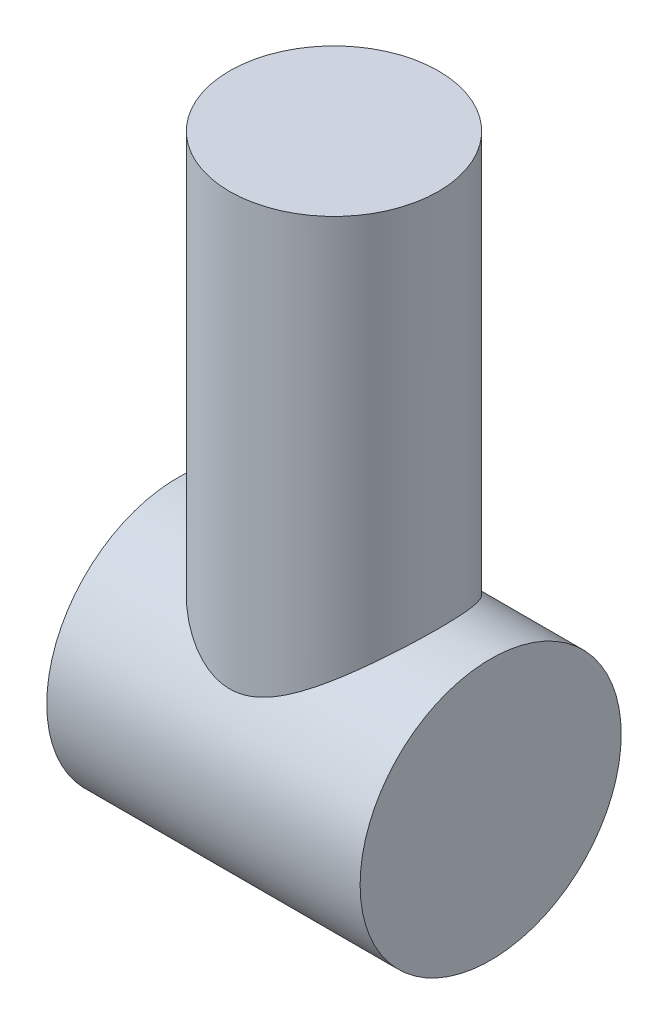
ISO-10303-21;
HEADER;
FILE_DESCRIPTION(('STEP AP214'),'2;1');
FILE_NAME('part.step','',(''),(''),'','','');
FILE_SCHEMA(('AUTOMOTIVE_DESIGN { 1 0 10303 214 1 1 1 1 }'));
ENDSEC;
DATA;
#1=APPLICATION_CONTEXT('core data for automotive mechanical design processes');
#2=APPLICATION_PROTOCOL_DEFINITION('international standard','automotive_design',2000,#1);
#3=PRODUCT_CONTEXT('',#1,'mechanical');
#4=PRODUCT('Part','Part','',(#3));
#5=PRODUCT_RELATED_PRODUCT_CATEGORY('part','',(#4));
#6=PRODUCT_DEFINITION_FORMATION('','',#4);
#7=PRODUCT_DEFINITION_CONTEXT('part definition',#1,'design');
#8=PRODUCT_DEFINITION('design','',#6,#7);
#9=PRODUCT_DEFINITION_SHAPE('','',#8);
#10=(LENGTH_UNIT() NAMED_UNIT(*) SI_UNIT(.MILLI.,.METRE.));
#11=(NAMED_UNIT(*) PLANE_ANGLE_UNIT() SI_UNIT($,.RADIAN.));
#12=(NAMED_UNIT(*) SI_UNIT($,.STERADIAN.) SOLID_ANGLE_UNIT());
#13=UNCERTAINTY_MEASURE_WITH_UNIT(LENGTH_MEASURE(1.E-05),#10,'distance_accuracy_value','');
#14=(GEOMETRIC_REPRESENTATION_CONTEXT(3) GLOBAL_UNCERTAINTY_ASSIGNED_CONTEXT((#13)) GLOBAL_UNIT_ASSIGNED_CONTEXT((#10,
#11,#12)) REPRESENTATION_CONTEXT('',''));
#15=CARTESIAN_POINT('',(0.,0.,0.));
#16=DIRECTION('',(0.,0.,1.));
#17=DIRECTION('',(1.,0.,0.));
#18=AXIS2_PLACEMENT_3D('',#15,#16,#17);
#19=CARTESIAN_POINT('',(60.,0.,0.));
#20=DIRECTION('',(-1.,0.,0.));
#21=DIRECTION('',(0.,0.,1.));
#22=AXIS2_PLACEMENT_3D('',#19,#20,#21);
#23=CYLINDRICAL_SURFACE('',#22,50.);
#24=CARTESIAN_POINT('',(60.,0.,0.));
#25=DIRECTION('',(1.,0.,0.));
#26=DIRECTION('',(0.,0.,-1.));
#27=AXIS2_PLACEMENT_3D('',#24,#25,#26);
#28=CIRCLE('',#27,50.);
#29=CARTESIAN_POINT('',(60.,0.,-50.));
#30=VERTEX_POINT('',#29);
#31=EDGE_CURVE('E49',#30,#30,#28,.T.);
#32=ORIENTED_EDGE('',*,*,#31,.F.);
#33=EDGE_LOOP('',(#32));
#34=FACE_BOUND('',#33,.T.);
#35=CARTESIAN_POINT('',(-60.,0.,0.));
#36=DIRECTION('',(1.,0.,0.));
#37=DIRECTION('',(0.,0.,-1.));
#38=AXIS2_PLACEMENT_3D('',#35,#36,#37);
#39=CIRCLE('',#38,50.);
#40=CARTESIAN_POINT('',(-60.,0.,-50.));
#41=VERTEX_POINT('',#40);
#42=EDGE_CURVE('E54',#41,#41,#39,.T.);
#43=ORIENTED_EDGE('',*,*,#42,.T.);
#44=EDGE_LOOP('',(#43));
#45=FACE_BOUND('',#44,.T.);
#46=CARTESIAN_POINT('',(0.,30.,-40.));
#47=CARTESIAN_POINT('',(-0.751122990398141,30.0000178203235,-39.9999925269122));
#48=CARTESIAN_POINT('',(-1.50252067673578,30.0283505775227,-39.9787855969021));
#49=CARTESIAN_POINT('',(-2.99911379598747,30.140285036925,-39.8944595355263));
#50=CARTESIAN_POINT('',(-3.74430464849889,30.2239244268036,-39.8313118242663));
#51=CARTESIAN_POINT('',(-5.22461390950294,30.4427179314504,-39.664339027872));
#52=CARTESIAN_POINT('',(-5.95969710727951,30.5780197900784,-39.5603972562764));
#53=CARTESIAN_POINT('',(-7.41320048597728,30.8942047512392,-39.3139687313561));
#54=CARTESIAN_POINT('',(-8.13162091077393,31.0750871861969,-39.1714825425525));
#55=CARTESIAN_POINT('',(-9.79623855598217,31.5456120543016,-38.7942530911844));
#56=CARTESIAN_POINT('',(-10.7345745089901,31.8511895478381,-38.5446631890411));
#57=CARTESIAN_POINT('',(-12.5730102406591,32.5168421586471,-37.9847853521626));
#58=CARTESIAN_POINT('',(-13.4730924401397,32.8769419916853,-37.6744698708897));
#59=CARTESIAN_POINT('',(-15.2361127138096,33.6378567935277,-36.9966861664557));
#60=CARTESIAN_POINT('',(-16.0989622360154,34.0387619478291,-36.62909035089));
#61=CARTESIAN_POINT('',(-17.7858296037221,34.8682704813726,-35.8403575703398));
#62=CARTESIAN_POINT('',(-18.6098484340316,35.2968731575066,-35.4192219642131));
#63=CARTESIAN_POINT('',(-19.962800083598,36.031959316776,-34.6681322839552));
#64=CARTESIAN_POINT('',(-20.5020008847586,36.3337762564148,-34.3519553126949));
#65=CARTESIAN_POINT('',(-21.5628606204046,36.9427723349765,-33.696170499488));
#66=CARTESIAN_POINT('',(-22.0845184096139,37.2499518220062,-33.3565611321833));
#67=CARTESIAN_POINT('',(-23.623511133256,38.1758681855748,-32.3028887759119));
#68=CARTESIAN_POINT('',(-24.6147593934666,38.7989243373928,-31.5540405410991));
#69=CARTESIAN_POINT('',(-26.5249290511882,40.0380449861333,-29.9661371804381));
#70=CARTESIAN_POINT('',(-27.4439078978661,40.6541146964379,-29.1271549863322));
#71=CARTESIAN_POINT('',(-29.2065896466564,41.8642400610944,-27.3593135576988));
#72=CARTESIAN_POINT('',(-30.0503175776481,42.458302996299,-26.4304844226525));
#73=CARTESIAN_POINT('',(-31.4977478575285,43.4960561011453,-24.6762448481654));
#74=CARTESIAN_POINT('',(-32.115949709036,43.946277346342,-23.8666249073291));
#75=CARTESIAN_POINT('',(-33.2956657657205,44.8156482694602,-22.1911709692297));
#76=CARTESIAN_POINT('',(-33.8571825249898,45.2347993471015,-21.3253395076118));
#77=CARTESIAN_POINT('',(-34.9176540877612,46.0339146282601,-19.5405613232695));
#78=CARTESIAN_POINT('',(-35.4166869738989,46.4139276328604,-18.6216830324404));
#79=CARTESIAN_POINT('',(-36.3471035811712,47.1277295837673,-16.7330672193071));
#80=CARTESIAN_POINT('',(-36.7784985245793,47.4615261970745,-15.7633381697048));
#81=CARTESIAN_POINT('',(-37.5036081471341,48.0258013846222,-13.9384865095607));
#82=CARTESIAN_POINT('',(-37.8083061181932,48.2642588167213,-13.0901842420799));
#83=CARTESIAN_POINT('',(-38.3621363453427,48.6993235485005,-11.3651565849685));
#84=CARTESIAN_POINT('',(-38.611274283141,48.8959351273485,-10.4884341121712));
#85=CARTESIAN_POINT('',(-39.0505076950679,49.2435186108503,-8.71176432790538));
#86=CARTESIAN_POINT('',(-39.2406256488954,49.3945078916683,-7.81182600076425));
#87=CARTESIAN_POINT('',(-39.5590682899697,49.6478656908502,-5.99426812973508));
#88=CARTESIAN_POINT('',(-39.6873922393692,49.7502336286538,-5.07664837485911));
#89=CARTESIAN_POINT('',(-39.8804773507374,49.90439933437,-3.22721452396158));
#90=CARTESIAN_POINT('',(-39.945013773773,49.9560182979649,-2.29536190464623));
#91=CARTESIAN_POINT('',(-40.0086189555882,50.0068917568229,-0.427984084828431));
#92=CARTESIAN_POINT('',(-40.0076875884325,50.0061461513564,0.507541122735245));
#93=CARTESIAN_POINT('',(-39.940373543346,49.9523076120166,2.37473598409272));
#94=CARTESIAN_POINT('',(-39.8739886492367,49.8992129056651,3.30640550626498));
#95=CARTESIAN_POINT('',(-39.6769088344371,49.7418694372033,5.1585049801366));
#96=CARTESIAN_POINT('',(-39.5462153970233,49.6376218549343,6.07893519056889));
#97=CARTESIAN_POINT('',(-39.231530031509,49.3872898676081,7.85194272429601));
#98=CARTESIAN_POINT('',(-39.0508410036233,49.2438030400832,8.70547932442694));
#99=CARTESIAN_POINT('',(-38.6364032712668,48.9158012940137,10.3914334358338));
#100=CARTESIAN_POINT('',(-38.402656949325,48.7312882177536,11.223851893551));
#101=CARTESIAN_POINT('',(-37.8849589444315,48.3243676644268,12.8634821504492));
#102=CARTESIAN_POINT('',(-37.6010007177952,48.1019552484034,13.6706906480812));
#103=CARTESIAN_POINT('',(-36.9860071963118,47.6227633439233,15.2564289879566));
#104=CARTESIAN_POINT('',(-36.654969108341,47.3659818164912,16.0349571252174));
#105=CARTESIAN_POINT('',(-35.9149758848323,46.7955625623542,17.6341627104269));
#106=CARTESIAN_POINT('',(-35.5015878586591,46.4788311973496,18.4516836914474));
#107=CARTESIAN_POINT('',(-34.6260290683881,45.813544738396,20.0465934668215));
#108=CARTESIAN_POINT('',(-34.1638557125227,45.4649879538238,20.8239801257304));
#109=CARTESIAN_POINT('',(-33.1942133591662,44.7409401722455,22.3372354631001));
#110=CARTESIAN_POINT('',(-32.6867269058143,44.3654388064734,23.0730879617356));
#111=CARTESIAN_POINT('',(-31.6298295701958,43.5926161796057,24.5019113874992));
#112=CARTESIAN_POINT('',(-31.0804166673752,43.195293867156,25.1948802450253));
#113=CARTESIAN_POINT('',(-29.8250349619769,42.3001280031166,26.675717367891));
#114=CARTESIAN_POINT('',(-29.11013718542,41.7984438686029,27.4537099186477));
#115=CARTESIAN_POINT('',(-27.6268595956598,40.7793182934675,28.9458751540258));
#116=CARTESIAN_POINT('',(-26.8584709774552,40.2618742665697,29.6600372872748));
#117=CARTESIAN_POINT('',(-25.2697606938863,39.219900601655,31.0247834218242));
#118=CARTESIAN_POINT('',(-24.4493795685694,38.6953634110918,31.6752923842437));
#119=CARTESIAN_POINT('',(-22.7587591147082,37.6499596814756,32.911019184688));
#120=CARTESIAN_POINT('',(-21.8885257757745,37.129092709865,33.4962448415303));
#121=CARTESIAN_POINT('',(-20.1844765819773,36.1520952340375,34.5469234519174));
#122=CARTESIAN_POINT('',(-19.3552298064082,35.6945625429145,35.018483626754));
#123=CARTESIAN_POINT('',(-17.6552891123811,34.8020934828063,35.9055707512528));
#124=CARTESIAN_POINT('',(-16.7845904681895,34.3671597020952,36.3210912913011));
#125=CARTESIAN_POINT('',(-15.0026590094379,33.5329818876261,37.0926047952671));
#126=CARTESIAN_POINT('',(-14.0914983189026,33.1336778882579,37.4486986895865));
#127=CARTESIAN_POINT('',(-12.227303572312,32.3848640082721,38.0981124136019));
#128=CARTESIAN_POINT('',(-11.2742889085727,32.0353313788736,38.3914609530259));
#129=CARTESIAN_POINT('',(-9.62274449861405,31.4989766076415,38.8316365511875));
#130=CARTESIAN_POINT('',(-8.93444736713032,31.2949200995624,38.9959424117446));
#131=CARTESIAN_POINT('',(-7.5400712811517,30.925733743202,39.289370612952));
#132=CARTESIAN_POINT('',(-6.83399476518628,30.7605985885085,39.418497750131));
#133=CARTESIAN_POINT('',(-5.40831772150548,30.4756179187466,39.6392392994006));
#134=CARTESIAN_POINT('',(-4.68874575134313,30.3556860877638,39.7309252338478));
#135=CARTESIAN_POINT('',(-3.23908053632723,30.1658012528448,39.8752904177208));
#136=CARTESIAN_POINT('',(-2.50898752314859,30.0958471501022,39.9279705247268));
#137=CARTESIAN_POINT('',(-1.0394838608478,30.0089915300664,39.9932930312782));
#138=CARTESIAN_POINT('',(-0.300043654572292,29.9924052776987,40.0056975107182));
#139=CARTESIAN_POINT('',(1.17755652750127,30.0140112862331,39.9894896642405));
#140=CARTESIAN_POINT('',(1.9157165235631,30.0522026720179,39.9608779935891));
#141=CARTESIAN_POINT('',(3.38552006284369,30.1815346199805,39.8632843359137));
#142=CARTESIAN_POINT('',(4.11715472679539,30.2727386443193,39.7942539623745));
#143=CARTESIAN_POINT('',(5.56787543572386,30.5039000358003,39.6173332957434));
#144=CARTESIAN_POINT('',(6.28695953307224,30.6438649003628,39.5094370265819));
#145=CARTESIAN_POINT('',(7.88949858997947,31.0079074788052,39.2246830386668));
#146=CARTESIAN_POINT('',(8.76827359809957,31.2443223192317,39.0372674964946));
#147=CARTESIAN_POINT('',(10.4955502095021,31.7723017335529,38.6087568241132));
#148=CARTESIAN_POINT('',(11.3440422707208,32.0638835111693,38.3676449446219));
#149=CARTESIAN_POINT('',(13.0107883990043,32.6907130254673,37.8349943016357));
#150=CARTESIAN_POINT('',(13.8289631444909,33.0260661720772,37.5433332313735));
#151=CARTESIAN_POINT('',(15.4326319181296,33.7290156244949,36.9130906312775));
#152=CARTESIAN_POINT('',(16.2181244733366,34.096613381211,36.5745069896743));
#153=CARTESIAN_POINT('',(17.5482226986558,34.7520109594331,35.950570582982));
#154=CARTESIAN_POINT('',(18.1004323193602,35.0344463590249,35.6756504438163));
#155=CARTESIAN_POINT('',(19.1879315027797,35.6084731483554,35.1027214184537));
#156=CARTESIAN_POINT('',(19.7232195681956,35.9000653438055,34.8047104970823));
#157=CARTESIAN_POINT('',(20.7771574243706,36.4897166458539,34.1860096289316));
#158=CARTESIAN_POINT('',(21.2958013415365,36.7877779744906,33.8653118013086));
#159=CARTESIAN_POINT('',(22.3162818835027,37.3877827124319,33.2017158410115));
#160=CARTESIAN_POINT('',(22.8181189345029,37.6897260230255,32.8588182719412));
#161=CARTESIAN_POINT('',(24.2994210919163,38.5986001848617,31.7964835010605));
#162=CARTESIAN_POINT('',(25.2538515818867,39.2081061075746,31.0438897247251));
#163=CARTESIAN_POINT('',(27.0935123486317,40.4175587893502,29.4520067449392));
#164=CARTESIAN_POINT('',(27.9787534237229,41.0175070283871,28.6127311174851));
#165=CARTESIAN_POINT('',(29.6884884002108,42.2021463483808,26.8353484515049));
#166=CARTESIAN_POINT('',(30.5119290032764,42.7864952156538,25.8959966280986));
#167=CARTESIAN_POINT('',(32.0774711862631,43.9166363093902,23.9293682337955));
#168=CARTESIAN_POINT('',(32.8195600365923,44.4624224969856,22.9020779473046));
#169=CARTESIAN_POINT('',(33.8636648695378,45.240406928385,21.2992395140421));
#170=CARTESIAN_POINT('',(34.1998321097064,45.4926735761747,20.7553340090037));
#171=CARTESIAN_POINT('',(34.8483808680768,45.9822175985869,19.6469466764766));
#172=CARTESIAN_POINT('',(35.160763844175,46.2194958917938,19.0824661133122));
#173=CARTESIAN_POINT('',(35.7601850264606,46.6771186249757,17.9340033495816));
#174=CARTESIAN_POINT('',(36.0472383692441,46.8974731679746,17.35003308731));
#175=CARTESIAN_POINT('',(36.5948323348717,47.3196719606352,16.1630921602077));
#176=CARTESIAN_POINT('',(36.8553668181699,47.5215119228073,15.5601171375927));
#177=CARTESIAN_POINT('',(37.4357607728253,47.9728260304395,14.1195543001887));
#178=CARTESIAN_POINT('',(37.7439284532081,48.213835631252,13.274543149774));
#179=CARTESIAN_POINT('',(38.3050475414589,48.6543570320218,11.5559471874655));
#180=CARTESIAN_POINT('',(38.5580133304268,48.8538796394577,10.6823698859305));
#181=CARTESIAN_POINT('',(38.8934680798617,49.1192145187054,9.35450089031607));
#182=CARTESIAN_POINT('',(38.9979449647764,49.20199409206,8.90901051177504));
#183=CARTESIAN_POINT('',(39.1918899274242,49.3558583625691,8.01286052915381));
#184=CARTESIAN_POINT('',(39.2813606069524,49.4269450870033,7.56220183566877));
#185=CARTESIAN_POINT('',(39.5267621655023,49.6221216422433,6.20336966269361));
#186=CARTESIAN_POINT('',(39.6597056214385,49.7281461335618,5.2882491219164));
#187=CARTESIAN_POINT('',(39.8623707441476,49.8899276763513,3.44326759079604));
#188=CARTESIAN_POINT('',(39.9318573491636,49.9454978266033,2.5133646731471));
#189=CARTESIAN_POINT('',(40.0056035772472,50.004477958094,0.649283053048804));
#190=CARTESIAN_POINT('',(40.0098634592683,50.0078881464107,-0.284895632410795));
#191=CARTESIAN_POINT('',(39.9530726373531,49.9624632044614,-2.1500275406984));
#192=CARTESIAN_POINT('',(39.8920177510204,49.9136247284801,-3.0809805531423));
#193=CARTESIAN_POINT('',(39.7056453876052,49.7647980977788,-4.93225991944024));
#194=CARTESIAN_POINT('',(39.5803293174492,49.6648110628991,-5.85258650549691));
#195=CARTESIAN_POINT('',(39.275910070966,49.4225567513423,-7.62687736900292));
#196=CARTESIAN_POINT('',(39.1000523370763,49.2828448667008,-8.48175343826513));
#197=CARTESIAN_POINT('',(38.695075198844,48.962164514591,-10.1708102372591));
#198=CARTESIAN_POINT('',(38.4659581365647,48.7811978612958,-11.0049918752377));
#199=CARTESIAN_POINT('',(37.9572835267643,48.3810986652852,-12.6485096364571));
#200=CARTESIAN_POINT('',(37.6777190280451,48.1619608630772,-13.4578423177318));
#201=CARTESIAN_POINT('',(37.0712638340543,47.6890195122925,-15.0481142720401));
#202=CARTESIAN_POINT('',(36.744370378791,47.4352139421112,-15.8290518858881));
#203=CARTESIAN_POINT('',(36.0139483070612,46.8715859436985,-17.4310319956891));
#204=CARTESIAN_POINT('',(35.60612019505,46.5587492639292,-18.2490517281039));
#205=CARTESIAN_POINT('',(34.741679587771,45.901041641536,-19.8453975491423));
#206=CARTESIAN_POINT('',(34.2850645935587,45.5561690580983,-20.6237216014681));
#207=CARTESIAN_POINT('',(33.3265502471064,44.8392426687326,-22.1392242610708));
#208=CARTESIAN_POINT('',(32.8246347320085,44.4671791703882,-22.8763880296393));
#209=CARTESIAN_POINT('',(31.7788881313452,43.7009282515024,-24.3081945546738));
#210=CARTESIAN_POINT('',(31.2350550029208,43.3067397529517,-25.0028352358092));
#211=CARTESIAN_POINT('',(29.992809899755,42.4186638664831,-26.4867839425898));
#212=CARTESIAN_POINT('',(29.2855428298328,41.9208849394087,-27.2663650104514));
#213=CARTESIAN_POINT('',(27.8177573103381,40.9089821790431,-28.7623161555728));
#214=CARTESIAN_POINT('',(27.0572302982712,40.3948557248798,-29.4786760268522));
#215=CARTESIAN_POINT('',(25.4845386878976,39.3587491292204,-30.8484531398946));
#216=CARTESIAN_POINT('',(24.6723141922931,38.8367604330584,-31.5017950808976));
#217=CARTESIAN_POINT('',(22.9983901466793,37.7954524562753,-32.7438580626375));
#218=CARTESIAN_POINT('',(22.1366960842733,37.2761328865074,-33.3325862498902));
#219=CARTESIAN_POINT('',(20.4355700149095,36.2928443663921,-34.3993066121692));
#220=CARTESIAN_POINT('',(19.5999643101837,35.8277933865625,-34.8824025807077));
#221=CARTESIAN_POINT('',(17.8863100660442,34.9197914966372,-35.7913495020475));
#222=CARTESIAN_POINT('',(17.0082558719777,34.4768435469929,-36.2171927993726));
#223=CARTESIAN_POINT('',(15.2103064415736,33.626282348374,-37.0082416069547));
#224=CARTESIAN_POINT('',(14.2904707619776,33.2186210701502,-37.3735301797219));
#225=CARTESIAN_POINT('',(12.4078312627232,32.4532856338418,-38.0400009003501));
#226=CARTESIAN_POINT('',(11.4450493435998,32.0955863734459,-38.3412152809445));
#227=CARTESIAN_POINT('',(9.76945161316861,31.5438612180614,-38.795260465122));
#228=CARTESIAN_POINT('',(9.06699911238058,31.332727911508,-38.9656217787854));
#229=CARTESIAN_POINT('',(7.64323111660719,30.9507513934912,-39.2697168200513));
#230=CARTESIAN_POINT('',(6.9219149244158,30.7799096735579,-39.4034491917385));
#231=CARTESIAN_POINT('',(5.46598313921994,30.4855782635895,-39.6316062412837));
#232=CARTESIAN_POINT('',(4.73141838508085,30.3619364919151,-39.7261572499965));
#233=CARTESIAN_POINT('',(3.25159792145975,30.1668050112252,-39.8745428201987));
#234=CARTESIAN_POINT('',(2.50635007124209,30.0952787869042,-39.9284058910931));
#235=CARTESIAN_POINT('',(1.46618302317928,30.0343802559873,-39.9741954767061));
#236=CARTESIAN_POINT('',(1.17321269547466,30.0215017802563,-39.9838661536084));
#237=CARTESIAN_POINT('',(0.586842254228908,30.0043076138784,-39.9967702940806));
#238=CARTESIAN_POINT('',(0.293442089704807,29.9999930381136,-40.0000029195199));
#239=CARTESIAN_POINT('',(0.,30.,-40.));
#240=B_SPLINE_CURVE_WITH_KNOTS('',3,(#46,#47,#48,#49,#50,#51,#52,#53,#54,#55,#56,#57,#58,#59,
#60,#61,#62,#63,#64,#65,#66,#67,#68,#69,#70,#71,#72,#73,#74,#75,#76,#77,#78,#79,#80,#81,#82,#83,
#84,#85,#86,#87,#88,#89,#90,#91,#92,#93,#94,#95,#96,#97,#98,#99,#100,#101,#102,#103,#104,#105,
#106,#107,#108,#109,#110,#111,#112,#113,#114,#115,#116,#117,#118,#119,#120,#121,#122,#123,#124,
#125,#126,#127,#128,#129,#130,#131,#132,#133,#134,#135,#136,#137,#138,#139,#140,#141,#142,#143,
#144,#145,#146,#147,#148,#149,#150,#151,#152,#153,#154,#155,#156,#157,#158,#159,#160,#161,#162,
#163,#164,#165,#166,#167,#168,#169,#170,#171,#172,#173,#174,#175,#176,#177,#178,#179,#180,#181,
#182,#183,#184,#185,#186,#187,#188,#189,#190,#191,#192,#193,#194,#195,#196,#197,#198,#199,#200,
#201,#202,#203,#204,#205,#206,#207,#208,#209,#210,#211,#212,#213,#214,#215,#216,#217,#218,#219,
#220,#221,#222,#223,#224,#225,#226,#227,#228,#229,#230,#231,#232,#233,#234,#235,#236,#237,#238,
#239),.UNSPECIFIED.,.T.,.F.,(4,2,2,2,2,2,2,2,2,2,2,2,2,2,2,2,2,2,2,2,2,2,2,2,2,2,2,2,2,2,2,2,2,
2,2,2,2,2,2,2,2,2,2,2,2,2,2,2,2,2,2,2,2,2,2,2,2,2,2,2,2,2,2,2,2,2,2,2,2,2,2,2,2,2,2,2,2,2,2,2,2,
2,2,2,2,2,2,2,2,2,2,2,2,2,2,2,4),(0.,2.25303149904944,4.50759986880841,6.7686647172983,
9.02969645205603,12.0785958796795,15.1288815786145,18.1860615893783,21.2431640233742,
23.3248987013309,25.4067690202281,29.5709126620713,33.7317119159888,37.8911220630696,
41.229276881214,44.5672812230338,47.9010717071505,51.234308472618,54.0286143644493,
56.8226343724012,59.6155888766986,62.4085767292672,65.2113702475375,68.0141691573248,
70.8170629698144,73.6198921365912,76.2695547459254,78.919098396128,81.5689875933259,
84.2190340670722,87.1241722312113,90.029464811361,92.9358814595879,95.842438264812,
99.3480226954965,102.854185542888,106.364433127954,109.874259847085,113.045934890927,
116.217972392566,119.384566424193,122.549708436645,124.757321252134,126.96463291446,
129.167708092431,131.370734832271,133.586752052175,135.802733869797,138.021373949357,
140.240355315575,143.023374253897,145.807262507029,148.597983054975,151.388829241245,
153.423521678166,155.458393653184,157.493975994294,159.529506676589,163.603758004967,
167.677372194373,171.809408952817,175.942091355483,178.00348046705,180.064743120414,
182.12476553317,184.185263794886,186.975897458777,189.765803241436,191.160450401944,
192.554855506223,195.343379836044,198.142192221588,200.940993495693,203.739974000275,
206.53889322694,209.187689398329,211.836369111715,214.485414068154,217.134613566112,
220.030142962753,222.925820744358,225.822535795608,228.719392107917,232.20921149689,
235.699593230891,239.19409528929,242.688210452733,245.900019450583,249.112257485621,
252.320052187454,255.526229361327,257.783396349104,260.040646880486,262.29056173534,
264.538898643806,265.418978507554,266.299172936034),.UNSPECIFIED.);
#241=CARTESIAN_POINT('',(0.,30.,-40.));
#242=VERTEX_POINT('',#241);
#243=EDGE_CURVE('E10',#242,#242,#240,.T.);
#244=ORIENTED_EDGE('',*,*,#243,.F.);
#245=EDGE_LOOP('',(#244));
#246=FACE_BOUND('',#245,.T.);
#247=ADVANCED_FACE('F37',(#34,#45,#246),#23,.T.);
#248=CARTESIAN_POINT('',(60.,0.,0.));
#249=DIRECTION('',(1.,0.,0.));
#250=DIRECTION('',(0.,0.,-1.));
#251=AXIS2_PLACEMENT_3D('',#248,#249,#250);
#252=PLANE('',#251);
#253=ORIENTED_EDGE('',*,*,#31,.T.);
#254=EDGE_LOOP('',(#253));
#255=FACE_BOUND('',#254,.T.);
#256=ADVANCED_FACE('F76',(#255),#252,.T.);
#257=CARTESIAN_POINT('',(-60.,0.,0.));
#258=DIRECTION('',(1.,0.,0.));
#259=DIRECTION('',(0.,0.,-1.));
#260=AXIS2_PLACEMENT_3D('',#257,#258,#259);
#261=PLANE('',#260);
#262=ORIENTED_EDGE('',*,*,#42,.F.);
#263=EDGE_LOOP('',(#262));
#264=FACE_BOUND('',#263,.T.);
#265=ADVANCED_FACE('F70',(#264),#261,.F.);
#266=CARTESIAN_POINT('',(0.,195.,0.));
#267=DIRECTION('',(0.,-1.,0.));
#268=DIRECTION('',(0.,0.,-1.));
#269=AXIS2_PLACEMENT_3D('',#266,#267,#268);
#270=CYLINDRICAL_SURFACE('',#269,40.);
#271=CARTESIAN_POINT('',(0.,195.,0.));
#272=DIRECTION('',(0.,1.,0.));
#273=DIRECTION('',(0.,0.,1.));
#274=AXIS2_PLACEMENT_3D('',#271,#272,#273);
#275=CIRCLE('',#274,40.);
#276=CARTESIAN_POINT('',(0.,195.,40.));
#277=VERTEX_POINT('',#276);
#278=EDGE_CURVE('E60',#277,#277,#275,.T.);
#279=ORIENTED_EDGE('',*,*,#278,.F.);
#280=EDGE_LOOP('',(#279));
#281=FACE_BOUND('',#280,.T.);
#282=ORIENTED_EDGE('',*,*,#243,.T.);
#283=EDGE_LOOP('',(#282));
#284=FACE_BOUND('',#283,.T.);
#285=ADVANCED_FACE('F68',(#281,#284),#270,.T.);
#286=CARTESIAN_POINT('',(0.,195.,0.));
#287=DIRECTION('',(0.,1.,0.));
#288=DIRECTION('',(0.,0.,1.));
#289=AXIS2_PLACEMENT_3D('',#286,#287,#288);
#290=PLANE('',#289);
#291=ORIENTED_EDGE('',*,*,#278,.T.);
#292=EDGE_LOOP('',(#291));
#293=FACE_BOUND('',#292,.T.);
#294=ADVANCED_FACE('F66',(#293),#290,.T.);
#295=CLOSED_SHELL('',(#247,#256,#265,#285,#294));
#296=MANIFOLD_SOLID_BREP('B2',#295);
#297=ADVANCED_BREP_SHAPE_REPRESENTATION('',(#18,#296),#14);
#298=SHAPE_DEFINITION_REPRESENTATION(#9,#297);
ENDSEC;
END-ISO-10303-21;
